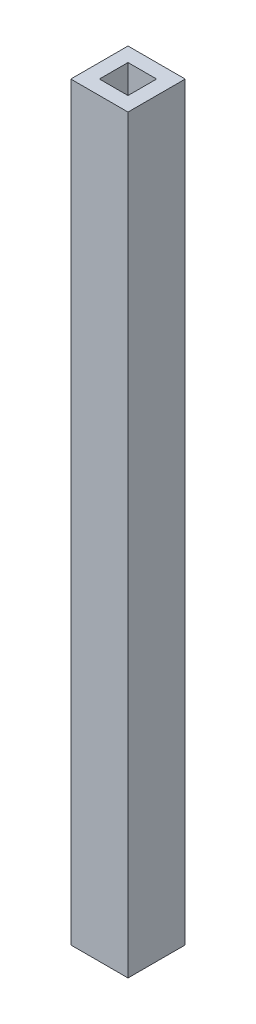
ISO-10303-21;
HEADER;
FILE_DESCRIPTION(('STEP AP214'),'2;1');
FILE_NAME('part.step','',(''),(''),'','','');
FILE_SCHEMA(('AUTOMOTIVE_DESIGN { 1 0 10303 214 1 1 1 1 }'));
ENDSEC;
DATA;
#1=APPLICATION_CONTEXT('core data for automotive mechanical design processes');
#2=APPLICATION_PROTOCOL_DEFINITION('international standard','automotive_design',2000,#1);
#3=PRODUCT_CONTEXT('',#1,'mechanical');
#4=PRODUCT('Part','Part','',(#3));
#5=PRODUCT_RELATED_PRODUCT_CATEGORY('part','',(#4));
#6=PRODUCT_DEFINITION_FORMATION('','',#4);
#7=PRODUCT_DEFINITION_CONTEXT('part definition',#1,'design');
#8=PRODUCT_DEFINITION('design','',#6,#7);
#9=PRODUCT_DEFINITION_SHAPE('','',#8);
#10=(LENGTH_UNIT() NAMED_UNIT(*) SI_UNIT(.MILLI.,.METRE.));
#11=(NAMED_UNIT(*) PLANE_ANGLE_UNIT() SI_UNIT($,.RADIAN.));
#12=(NAMED_UNIT(*) SI_UNIT($,.STERADIAN.) SOLID_ANGLE_UNIT());
#13=UNCERTAINTY_MEASURE_WITH_UNIT(LENGTH_MEASURE(1.E-05),#10,'distance_accuracy_value','');
#14=(GEOMETRIC_REPRESENTATION_CONTEXT(3) GLOBAL_UNCERTAINTY_ASSIGNED_CONTEXT((#13)) GLOBAL_UNIT_ASSIGNED_CONTEXT((#10,
#11,#12)) REPRESENTATION_CONTEXT('',''));
#15=CARTESIAN_POINT('',(0.,0.,0.));
#16=DIRECTION('',(0.,0.,1.));
#17=DIRECTION('',(1.,0.,0.));
#18=AXIS2_PLACEMENT_3D('',#15,#16,#17);
#19=CARTESIAN_POINT('',(0.,333.,0.));
#20=DIRECTION('',(0.,1.,0.));
#21=DIRECTION('',(0.,0.,1.));
#22=AXIS2_PLACEMENT_3D('',#19,#20,#21);
#23=PLANE('',#22);
#24=DIRECTION('',(0.,0.,1.));
#25=VECTOR('',#24,1.);
#26=CARTESIAN_POINT('',(0.,333.,-25.4));
#27=LINE('',#26,#25);
#28=CARTESIAN_POINT('',(0.,333.,-25.4));
#29=VERTEX_POINT('',#28);
#30=CARTESIAN_POINT('',(0.,333.,0.));
#31=VERTEX_POINT('',#30);
#32=EDGE_CURVE('E186',#29,#31,#27,.T.);
#33=ORIENTED_EDGE('',*,*,#32,.T.);
#34=DIRECTION('',(1.,0.,0.));
#35=VECTOR('',#34,1.);
#36=CARTESIAN_POINT('',(0.,333.,0.));
#37=LINE('',#36,#35);
#38=CARTESIAN_POINT('',(25.4,333.,0.));
#39=VERTEX_POINT('',#38);
#40=EDGE_CURVE('E196',#31,#39,#37,.T.);
#41=ORIENTED_EDGE('',*,*,#40,.T.);
#42=DIRECTION('',(0.,0.,-1.));
#43=VECTOR('',#42,1.);
#44=CARTESIAN_POINT('',(25.4,333.,0.));
#45=LINE('',#44,#43);
#46=CARTESIAN_POINT('',(25.4,333.,-25.4));
#47=VERTEX_POINT('',#46);
#48=EDGE_CURVE('E175',#39,#47,#45,.T.);
#49=ORIENTED_EDGE('',*,*,#48,.T.);
#50=DIRECTION('',(-1.,0.,0.));
#51=VECTOR('',#50,1.);
#52=CARTESIAN_POINT('',(25.4,333.,-25.4));
#53=LINE('',#52,#51);
#54=EDGE_CURVE('E160',#47,#29,#53,.T.);
#55=ORIENTED_EDGE('',*,*,#54,.T.);
#56=EDGE_LOOP('',(#33,#41,#49,#55));
#57=FACE_BOUND('',#56,.T.);
#58=DIRECTION('',(0.,0.,1.));
#59=VECTOR('',#58,1.);
#60=CARTESIAN_POINT('',(6.35,333.,-19.05));
#61=LINE('',#60,#59);
#62=CARTESIAN_POINT('',(6.35,333.,-19.05));
#63=VERTEX_POINT('',#62);
#64=CARTESIAN_POINT('',(6.35,333.,-6.35));
#65=VERTEX_POINT('',#64);
#66=EDGE_CURVE('E126',#63,#65,#61,.T.);
#67=ORIENTED_EDGE('',*,*,#66,.F.);
#68=DIRECTION('',(-1.,0.,0.));
#69=VECTOR('',#68,1.);
#70=CARTESIAN_POINT('',(19.05,333.,-19.05));
#71=LINE('',#70,#69);
#72=CARTESIAN_POINT('',(19.05,333.,-19.05));
#73=VERTEX_POINT('',#72);
#74=EDGE_CURVE('E117',#73,#63,#71,.T.);
#75=ORIENTED_EDGE('',*,*,#74,.F.);
#76=DIRECTION('',(0.,0.,-1.));
#77=VECTOR('',#76,1.);
#78=CARTESIAN_POINT('',(19.05,333.,-6.35));
#79=LINE('',#78,#77);
#80=CARTESIAN_POINT('',(19.05,333.,-6.35));
#81=VERTEX_POINT('',#80);
#82=EDGE_CURVE('E143',#81,#73,#79,.T.);
#83=ORIENTED_EDGE('',*,*,#82,.F.);
#84=DIRECTION('',(1.,0.,0.));
#85=VECTOR('',#84,1.);
#86=CARTESIAN_POINT('',(6.35,333.,-6.35));
#87=LINE('',#86,#85);
#88=EDGE_CURVE('E139',#65,#81,#87,.T.);
#89=ORIENTED_EDGE('',*,*,#88,.F.);
#90=EDGE_LOOP('',(#67,#75,#83,#89));
#91=FACE_BOUND('',#90,.T.);
#92=ADVANCED_FACE('F50',(#57,#91),#23,.T.);
#93=CARTESIAN_POINT('',(0.,0.,0.));
#94=DIRECTION('',(0.,1.,0.));
#95=DIRECTION('',(0.,0.,1.));
#96=AXIS2_PLACEMENT_3D('',#93,#94,#95);
#97=PLANE('',#96);
#98=DIRECTION('',(0.,0.,1.));
#99=VECTOR('',#98,1.);
#100=CARTESIAN_POINT('',(0.,0.,-25.4));
#101=LINE('',#100,#99);
#102=CARTESIAN_POINT('',(0.,0.,-25.4));
#103=VERTEX_POINT('',#102);
#104=CARTESIAN_POINT('',(0.,0.,0.));
#105=VERTEX_POINT('',#104);
#106=EDGE_CURVE('E135',#103,#105,#101,.T.);
#107=ORIENTED_EDGE('',*,*,#106,.F.);
#108=DIRECTION('',(-1.,0.,0.));
#109=VECTOR('',#108,1.);
#110=CARTESIAN_POINT('',(25.4,0.,-25.4));
#111=LINE('',#110,#109);
#112=CARTESIAN_POINT('',(25.4,0.,-25.4));
#113=VERTEX_POINT('',#112);
#114=EDGE_CURVE('E161',#113,#103,#111,.T.);
#115=ORIENTED_EDGE('',*,*,#114,.F.);
#116=DIRECTION('',(0.,0.,-1.));
#117=VECTOR('',#116,1.);
#118=CARTESIAN_POINT('',(25.4,0.,0.));
#119=LINE('',#118,#117);
#120=CARTESIAN_POINT('',(25.4,0.,0.));
#121=VERTEX_POINT('',#120);
#122=EDGE_CURVE('E174',#121,#113,#119,.T.);
#123=ORIENTED_EDGE('',*,*,#122,.F.);
#124=DIRECTION('',(1.,0.,0.));
#125=VECTOR('',#124,1.);
#126=CARTESIAN_POINT('',(0.,0.,0.));
#127=LINE('',#126,#125);
#128=EDGE_CURVE('E182',#105,#121,#127,.T.);
#129=ORIENTED_EDGE('',*,*,#128,.F.);
#130=EDGE_LOOP('',(#107,#115,#123,#129));
#131=FACE_BOUND('',#130,.T.);
#132=DIRECTION('',(-1.,0.,0.));
#133=VECTOR('',#132,1.);
#134=CARTESIAN_POINT('',(19.05,0.,-19.05));
#135=LINE('',#134,#133);
#136=CARTESIAN_POINT('',(19.05,0.,-19.05));
#137=VERTEX_POINT('',#136);
#138=CARTESIAN_POINT('',(6.35,0.,-19.05));
#139=VERTEX_POINT('',#138);
#140=EDGE_CURVE('E75',#137,#139,#135,.T.);
#141=ORIENTED_EDGE('',*,*,#140,.T.);
#142=DIRECTION('',(0.,0.,1.));
#143=VECTOR('',#142,1.);
#144=CARTESIAN_POINT('',(6.35,0.,-19.05));
#145=LINE('',#144,#143);
#146=CARTESIAN_POINT('',(6.35,0.,-6.35));
#147=VERTEX_POINT('',#146);
#148=EDGE_CURVE('E133',#139,#147,#145,.T.);
#149=ORIENTED_EDGE('',*,*,#148,.T.);
#150=DIRECTION('',(1.,0.,0.));
#151=VECTOR('',#150,1.);
#152=CARTESIAN_POINT('',(6.35,0.,-6.35));
#153=LINE('',#152,#151);
#154=CARTESIAN_POINT('',(19.05,0.,-6.35));
#155=VERTEX_POINT('',#154);
#156=EDGE_CURVE('E211',#147,#155,#153,.T.);
#157=ORIENTED_EDGE('',*,*,#156,.T.);
#158=DIRECTION('',(0.,0.,-1.));
#159=VECTOR('',#158,1.);
#160=CARTESIAN_POINT('',(19.05,0.,-6.35));
#161=LINE('',#160,#159);
#162=EDGE_CURVE('E127',#155,#137,#161,.T.);
#163=ORIENTED_EDGE('',*,*,#162,.T.);
#164=EDGE_LOOP('',(#141,#149,#157,#163));
#165=FACE_BOUND('',#164,.T.);
#166=ADVANCED_FACE('F180',(#131,#165),#97,.F.);
#167=CARTESIAN_POINT('',(0.,333.,-25.4));
#168=DIRECTION('',(1.,0.,0.));
#169=DIRECTION('',(0.,0.,-1.));
#170=AXIS2_PLACEMENT_3D('',#167,#168,#169);
#171=PLANE('',#170);
#172=ORIENTED_EDGE('',*,*,#106,.T.);
#173=DIRECTION('',(0.,-1.,0.));
#174=VECTOR('',#173,1.);
#175=CARTESIAN_POINT('',(0.,333.,0.));
#176=LINE('',#175,#174);
#177=EDGE_CURVE('E12',#31,#105,#176,.T.);
#178=ORIENTED_EDGE('',*,*,#177,.F.);
#179=ORIENTED_EDGE('',*,*,#32,.F.);
#180=DIRECTION('',(0.,-1.,0.));
#181=VECTOR('',#180,1.);
#182=CARTESIAN_POINT('',(0.,333.,-25.4));
#183=LINE('',#182,#181);
#184=EDGE_CURVE('E153',#29,#103,#183,.T.);
#185=ORIENTED_EDGE('',*,*,#184,.T.);
#186=EDGE_LOOP('',(#172,#178,#179,#185));
#187=FACE_BOUND('',#186,.T.);
#188=ADVANCED_FACE('F52',(#187),#171,.F.);
#189=CARTESIAN_POINT('',(0.,333.,0.));
#190=DIRECTION('',(0.,0.,-1.));
#191=DIRECTION('',(-1.,0.,0.));
#192=AXIS2_PLACEMENT_3D('',#189,#190,#191);
#193=PLANE('',#192);
#194=ORIENTED_EDGE('',*,*,#128,.T.);
#195=DIRECTION('',(0.,-1.,0.));
#196=VECTOR('',#195,1.);
#197=CARTESIAN_POINT('',(25.4,333.,0.));
#198=LINE('',#197,#196);
#199=EDGE_CURVE('E60',#39,#121,#198,.T.);
#200=ORIENTED_EDGE('',*,*,#199,.F.);
#201=ORIENTED_EDGE('',*,*,#40,.F.);
#202=ORIENTED_EDGE('',*,*,#177,.T.);
#203=EDGE_LOOP('',(#194,#200,#201,#202));
#204=FACE_BOUND('',#203,.T.);
#205=ADVANCED_FACE('F244',(#204),#193,.F.);
#206=CARTESIAN_POINT('',(25.4,333.,0.));
#207=DIRECTION('',(-1.,0.,0.));
#208=DIRECTION('',(0.,0.,1.));
#209=AXIS2_PLACEMENT_3D('',#206,#207,#208);
#210=PLANE('',#209);
#211=ORIENTED_EDGE('',*,*,#122,.T.);
#212=DIRECTION('',(0.,-1.,0.));
#213=VECTOR('',#212,1.);
#214=CARTESIAN_POINT('',(25.4,333.,-25.4));
#215=LINE('',#214,#213);
#216=EDGE_CURVE('E159',#47,#113,#215,.T.);
#217=ORIENTED_EDGE('',*,*,#216,.F.);
#218=ORIENTED_EDGE('',*,*,#48,.F.);
#219=ORIENTED_EDGE('',*,*,#199,.T.);
#220=EDGE_LOOP('',(#211,#217,#218,#219));
#221=FACE_BOUND('',#220,.T.);
#222=ADVANCED_FACE('F172',(#221),#210,.F.);
#223=CARTESIAN_POINT('',(25.4,333.,-25.4));
#224=DIRECTION('',(0.,0.,1.));
#225=DIRECTION('',(1.,0.,0.));
#226=AXIS2_PLACEMENT_3D('',#223,#224,#225);
#227=PLANE('',#226);
#228=ORIENTED_EDGE('',*,*,#114,.T.);
#229=ORIENTED_EDGE('',*,*,#184,.F.);
#230=ORIENTED_EDGE('',*,*,#54,.F.);
#231=ORIENTED_EDGE('',*,*,#216,.T.);
#232=EDGE_LOOP('',(#228,#229,#230,#231));
#233=FACE_BOUND('',#232,.T.);
#234=ADVANCED_FACE('F240',(#233),#227,.F.);
#235=CARTESIAN_POINT('',(19.05,333.,-19.05));
#236=DIRECTION('',(0.,0.,1.));
#237=DIRECTION('',(1.,0.,0.));
#238=AXIS2_PLACEMENT_3D('',#235,#236,#237);
#239=PLANE('',#238);
#240=ORIENTED_EDGE('',*,*,#140,.F.);
#241=DIRECTION('',(0.,-1.,0.));
#242=VECTOR('',#241,1.);
#243=CARTESIAN_POINT('',(19.05,333.,-19.05));
#244=LINE('',#243,#242);
#245=EDGE_CURVE('E121',#73,#137,#244,.T.);
#246=ORIENTED_EDGE('',*,*,#245,.F.);
#247=ORIENTED_EDGE('',*,*,#74,.T.);
#248=DIRECTION('',(0.,-1.,0.));
#249=VECTOR('',#248,1.);
#250=CARTESIAN_POINT('',(6.35,333.,-19.05));
#251=LINE('',#250,#249);
#252=EDGE_CURVE('E120',#63,#139,#251,.T.);
#253=ORIENTED_EDGE('',*,*,#252,.T.);
#254=EDGE_LOOP('',(#240,#246,#247,#253));
#255=FACE_BOUND('',#254,.T.);
#256=ADVANCED_FACE('F119',(#255),#239,.T.);
#257=CARTESIAN_POINT('',(6.35,333.,-19.05));
#258=DIRECTION('',(1.,0.,0.));
#259=DIRECTION('',(0.,0.,-1.));
#260=AXIS2_PLACEMENT_3D('',#257,#258,#259);
#261=PLANE('',#260);
#262=ORIENTED_EDGE('',*,*,#148,.F.);
#263=ORIENTED_EDGE('',*,*,#252,.F.);
#264=ORIENTED_EDGE('',*,*,#66,.T.);
#265=DIRECTION('',(0.,-1.,0.));
#266=VECTOR('',#265,1.);
#267=CARTESIAN_POINT('',(6.35,333.,-6.35));
#268=LINE('',#267,#266);
#269=EDGE_CURVE('E136',#65,#147,#268,.T.);
#270=ORIENTED_EDGE('',*,*,#269,.T.);
#271=EDGE_LOOP('',(#262,#263,#264,#270));
#272=FACE_BOUND('',#271,.T.);
#273=ADVANCED_FACE('F130',(#272),#261,.T.);
#274=CARTESIAN_POINT('',(6.35,333.,-6.35));
#275=DIRECTION('',(0.,0.,-1.));
#276=DIRECTION('',(-1.,0.,0.));
#277=AXIS2_PLACEMENT_3D('',#274,#275,#276);
#278=PLANE('',#277);
#279=ORIENTED_EDGE('',*,*,#156,.F.);
#280=ORIENTED_EDGE('',*,*,#269,.F.);
#281=ORIENTED_EDGE('',*,*,#88,.T.);
#282=DIRECTION('',(0.,-1.,0.));
#283=VECTOR('',#282,1.);
#284=CARTESIAN_POINT('',(19.05,333.,-6.35));
#285=LINE('',#284,#283);
#286=EDGE_CURVE('E67',#81,#155,#285,.T.);
#287=ORIENTED_EDGE('',*,*,#286,.T.);
#288=EDGE_LOOP('',(#279,#280,#281,#287));
#289=FACE_BOUND('',#288,.T.);
#290=ADVANCED_FACE('F222',(#289),#278,.T.);
#291=CARTESIAN_POINT('',(19.05,333.,-6.35));
#292=DIRECTION('',(-1.,0.,0.));
#293=DIRECTION('',(0.,0.,1.));
#294=AXIS2_PLACEMENT_3D('',#291,#292,#293);
#295=PLANE('',#294);
#296=ORIENTED_EDGE('',*,*,#162,.F.);
#297=ORIENTED_EDGE('',*,*,#286,.F.);
#298=ORIENTED_EDGE('',*,*,#82,.T.);
#299=ORIENTED_EDGE('',*,*,#245,.T.);
#300=EDGE_LOOP('',(#296,#297,#298,#299));
#301=FACE_BOUND('',#300,.T.);
#302=ADVANCED_FACE('F219',(#301),#295,.T.);
#303=CLOSED_SHELL('',(#92,#166,#188,#205,#222,#234,#256,#273,#290,#302));
#304=MANIFOLD_SOLID_BREP('B2',#303);
#305=ADVANCED_BREP_SHAPE_REPRESENTATION('',(#18,#304),#14);
#306=SHAPE_DEFINITION_REPRESENTATION(#9,#305);
ENDSEC;
END-ISO-10303-21;
